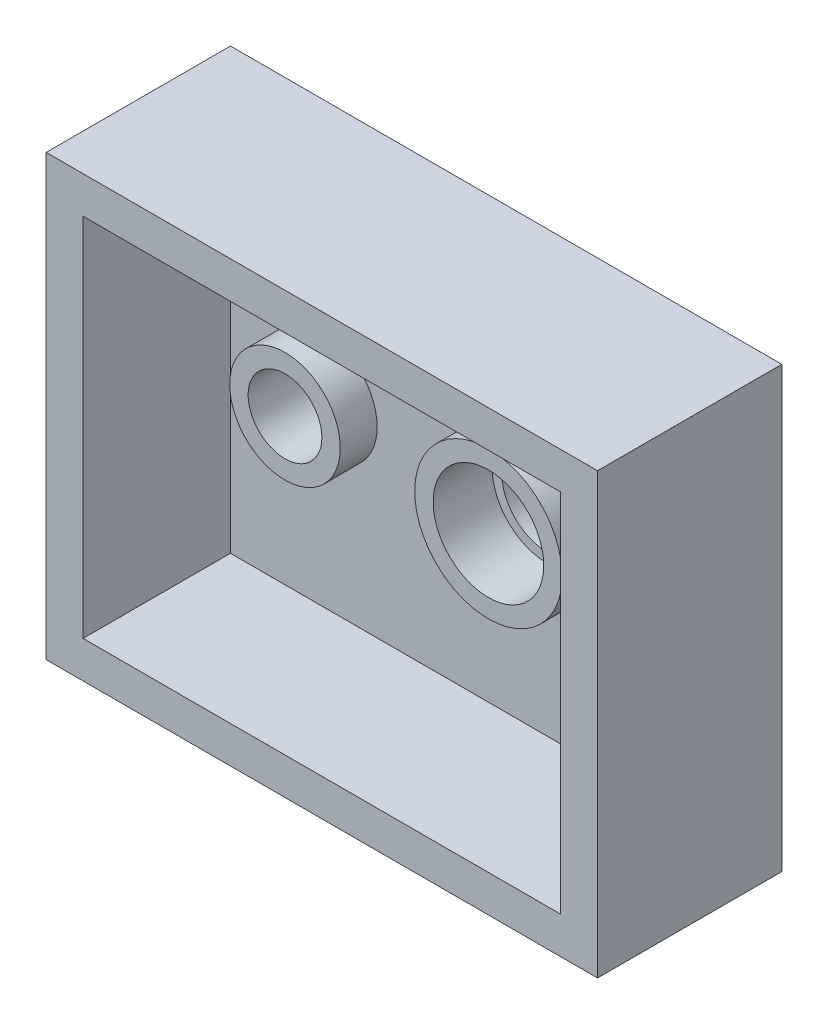
ISO-10303-21;
HEADER;
FILE_DESCRIPTION(('STEP AP214'),'2;1');
FILE_NAME('part.step','',(''),(''),'','','');
FILE_SCHEMA(('AUTOMOTIVE_DESIGN { 1 0 10303 214 1 1 1 1 }'));
ENDSEC;
DATA;
#1=APPLICATION_CONTEXT('core data for automotive mechanical design processes');
#2=APPLICATION_PROTOCOL_DEFINITION('international standard','automotive_design',2000,#1);
#3=PRODUCT_CONTEXT('',#1,'mechanical');
#4=PRODUCT('Part','Part','',(#3));
#5=PRODUCT_RELATED_PRODUCT_CATEGORY('part','',(#4));
#6=PRODUCT_DEFINITION_FORMATION('','',#4);
#7=PRODUCT_DEFINITION_CONTEXT('part definition',#1,'design');
#8=PRODUCT_DEFINITION('design','',#6,#7);
#9=PRODUCT_DEFINITION_SHAPE('','',#8);
#10=(LENGTH_UNIT() NAMED_UNIT(*) SI_UNIT(.MILLI.,.METRE.));
#11=(NAMED_UNIT(*) PLANE_ANGLE_UNIT() SI_UNIT($,.RADIAN.));
#12=(NAMED_UNIT(*) SI_UNIT($,.STERADIAN.) SOLID_ANGLE_UNIT());
#13=UNCERTAINTY_MEASURE_WITH_UNIT(LENGTH_MEASURE(1.E-05),#10,'distance_accuracy_value','');
#14=(GEOMETRIC_REPRESENTATION_CONTEXT(3) GLOBAL_UNCERTAINTY_ASSIGNED_CONTEXT((#13)) GLOBAL_UNIT_ASSIGNED_CONTEXT((#10,
#11,#12)) REPRESENTATION_CONTEXT('',''));
#15=CARTESIAN_POINT('',(0.,0.,0.));
#16=DIRECTION('',(0.,0.,1.));
#17=DIRECTION('',(1.,0.,0.));
#18=AXIS2_PLACEMENT_3D('',#15,#16,#17);
#19=CARTESIAN_POINT('',(-11.049,18.923,3.175));
#20=DIRECTION('',(1.,0.,0.));
#21=DIRECTION('',(0.,1.,0.));
#22=AXIS2_PLACEMENT_3D('',#19,#20,#21);
#23=PLANE('',#22);
#24=DIRECTION('',(0.,-1.,0.));
#25=VECTOR('',#24,1.);
#26=CARTESIAN_POINT('',(-11.049,18.923,0.));
#27=LINE('',#26,#25);
#28=CARTESIAN_POINT('',(-11.049,18.923,0.));
#29=VERTEX_POINT('',#28);
#30=CARTESIAN_POINT('',(-11.049,-18.923,0.));
#31=VERTEX_POINT('',#30);
#32=EDGE_CURVE('E111',#29,#31,#27,.T.);
#33=ORIENTED_EDGE('',*,*,#32,.T.);
#34=DIRECTION('',(0.,0.,-1.));
#35=VECTOR('',#34,1.);
#36=CARTESIAN_POINT('',(-11.049,-18.923,3.175));
#37=LINE('',#36,#35);
#38=CARTESIAN_POINT('',(-11.049,-18.923,15.875));
#39=VERTEX_POINT('',#38);
#40=EDGE_CURVE('E174',#39,#31,#37,.T.);
#41=ORIENTED_EDGE('',*,*,#40,.F.);
#42=DIRECTION('',(0.,-1.,0.));
#43=VECTOR('',#42,1.);
#44=CARTESIAN_POINT('',(-11.049,0.,15.875));
#45=LINE('',#44,#43);
#46=CARTESIAN_POINT('',(-11.049,18.923,15.875));
#47=VERTEX_POINT('',#46);
#48=EDGE_CURVE('E137',#47,#39,#45,.T.);
#49=ORIENTED_EDGE('',*,*,#48,.F.);
#50=DIRECTION('',(0.,0.,-1.));
#51=VECTOR('',#50,1.);
#52=CARTESIAN_POINT('',(-11.049,18.923,3.175));
#53=LINE('',#52,#51);
#54=EDGE_CURVE('E169',#47,#29,#53,.T.);
#55=ORIENTED_EDGE('',*,*,#54,.T.);
#56=EDGE_LOOP('',(#33,#41,#49,#55));
#57=FACE_BOUND('',#56,.T.);
#58=ADVANCED_FACE('F37',(#57),#23,.F.);
#59=CARTESIAN_POINT('',(-11.049,-18.923,3.175));
#60=DIRECTION('',(0.,1.,0.));
#61=DIRECTION('',(0.,0.,1.));
#62=AXIS2_PLACEMENT_3D('',#59,#60,#61);
#63=PLANE('',#62);
#64=DIRECTION('',(1.,0.,0.));
#65=VECTOR('',#64,1.);
#66=CARTESIAN_POINT('',(-11.049,-18.923,0.));
#67=LINE('',#66,#65);
#68=CARTESIAN_POINT('',(36.449,-18.923,0.));
#69=VERTEX_POINT('',#68);
#70=EDGE_CURVE('E162',#31,#69,#67,.T.);
#71=ORIENTED_EDGE('',*,*,#70,.T.);
#72=DIRECTION('',(0.,0.,-1.));
#73=VECTOR('',#72,1.);
#74=CARTESIAN_POINT('',(36.449,-18.923,3.175));
#75=LINE('',#74,#73);
#76=CARTESIAN_POINT('',(36.449,-18.923,15.875));
#77=VERTEX_POINT('',#76);
#78=EDGE_CURVE('E175',#77,#69,#75,.T.);
#79=ORIENTED_EDGE('',*,*,#78,.F.);
#80=DIRECTION('',(1.,0.,0.));
#81=VECTOR('',#80,1.);
#82=CARTESIAN_POINT('',(0.,-18.923,15.875));
#83=LINE('',#82,#81);
#84=EDGE_CURVE('E143',#39,#77,#83,.T.);
#85=ORIENTED_EDGE('',*,*,#84,.F.);
#86=ORIENTED_EDGE('',*,*,#40,.T.);
#87=EDGE_LOOP('',(#71,#79,#85,#86));
#88=FACE_BOUND('',#87,.T.);
#89=ADVANCED_FACE('F231',(#88),#63,.F.);
#90=CARTESIAN_POINT('',(36.449,18.923,3.175));
#91=DIRECTION('',(-1.,0.,0.));
#92=DIRECTION('',(0.,-1.,0.));
#93=AXIS2_PLACEMENT_3D('',#90,#91,#92);
#94=PLANE('',#93);
#95=DIRECTION('',(0.,1.,0.));
#96=VECTOR('',#95,1.);
#97=CARTESIAN_POINT('',(36.449,18.923,0.));
#98=LINE('',#97,#96);
#99=CARTESIAN_POINT('',(36.449,18.923,0.));
#100=VERTEX_POINT('',#99);
#101=EDGE_CURVE('E164',#69,#100,#98,.T.);
#102=ORIENTED_EDGE('',*,*,#101,.T.);
#103=DIRECTION('',(0.,0.,-1.));
#104=VECTOR('',#103,1.);
#105=CARTESIAN_POINT('',(36.449,18.923,3.175));
#106=LINE('',#105,#104);
#107=CARTESIAN_POINT('',(36.449,18.923,15.875));
#108=VERTEX_POINT('',#107);
#109=EDGE_CURVE('E168',#108,#100,#106,.T.);
#110=ORIENTED_EDGE('',*,*,#109,.F.);
#111=DIRECTION('',(0.,1.,0.));
#112=VECTOR('',#111,1.);
#113=CARTESIAN_POINT('',(36.449,0.,15.875));
#114=LINE('',#113,#112);
#115=EDGE_CURVE('E145',#77,#108,#114,.T.);
#116=ORIENTED_EDGE('',*,*,#115,.F.);
#117=ORIENTED_EDGE('',*,*,#78,.T.);
#118=EDGE_LOOP('',(#102,#110,#116,#117));
#119=FACE_BOUND('',#118,.T.);
#120=ADVANCED_FACE('F237',(#119),#94,.F.);
#121=CARTESIAN_POINT('',(-11.049,18.923,3.175));
#122=DIRECTION('',(0.,-1.,0.));
#123=DIRECTION('',(0.,0.,-1.));
#124=AXIS2_PLACEMENT_3D('',#121,#122,#123);
#125=PLANE('',#124);
#126=DIRECTION('',(-1.,0.,0.));
#127=VECTOR('',#126,1.);
#128=CARTESIAN_POINT('',(-11.049,18.923,0.));
#129=LINE('',#128,#127);
#130=EDGE_CURVE('E63',#100,#29,#129,.T.);
#131=ORIENTED_EDGE('',*,*,#130,.T.);
#132=ORIENTED_EDGE('',*,*,#54,.F.);
#133=DIRECTION('',(-1.,0.,0.));
#134=VECTOR('',#133,1.);
#135=CARTESIAN_POINT('',(0.,18.923,15.875));
#136=LINE('',#135,#134);
#137=EDGE_CURVE('E134',#108,#47,#136,.T.);
#138=ORIENTED_EDGE('',*,*,#137,.F.);
#139=ORIENTED_EDGE('',*,*,#109,.T.);
#140=EDGE_LOOP('',(#131,#132,#138,#139));
#141=FACE_BOUND('',#140,.T.);
#142=ADVANCED_FACE('F250',(#141),#125,.F.);
#143=CARTESIAN_POINT('',(0.,0.,0.));
#144=DIRECTION('',(0.,0.,1.));
#145=DIRECTION('',(1.,0.,0.));
#146=AXIS2_PLACEMENT_3D('',#143,#144,#145);
#147=PLANE('',#146);
#148=CARTESIAN_POINT('',(0.,0.,0.));
#149=DIRECTION('',(0.,0.,1.));
#150=DIRECTION('',(1.,0.,0.));
#151=AXIS2_PLACEMENT_3D('',#148,#149,#150);
#152=CIRCLE('',#151,1.524);
#153=CARTESIAN_POINT('',(1.524,0.,0.));
#154=VERTEX_POINT('',#153);
#155=EDGE_CURVE('E182',#154,#154,#152,.T.);
#156=ORIENTED_EDGE('',*,*,#155,.T.);
#157=EDGE_LOOP('',(#156));
#158=FACE_BOUND('',#157,.T.);
#159=CARTESIAN_POINT('',(17.526,0.,0.));
#160=DIRECTION('',(0.,0.,1.));
#161=DIRECTION('',(1.,0.,0.));
#162=AXIS2_PLACEMENT_3D('',#159,#160,#161);
#163=CIRCLE('',#162,3.937);
#164=CARTESIAN_POINT('',(21.463,0.,0.));
#165=VERTEX_POINT('',#164);
#166=EDGE_CURVE('E190',#165,#165,#163,.T.);
#167=ORIENTED_EDGE('',*,*,#166,.T.);
#168=EDGE_LOOP('',(#167));
#169=FACE_BOUND('',#168,.T.);
#170=ORIENTED_EDGE('',*,*,#32,.F.);
#171=ORIENTED_EDGE('',*,*,#130,.F.);
#172=ORIENTED_EDGE('',*,*,#101,.F.);
#173=ORIENTED_EDGE('',*,*,#70,.F.);
#174=EDGE_LOOP('',(#170,#171,#172,#173));
#175=FACE_BOUND('',#174,.T.);
#176=ADVANCED_FACE('F241',(#158,#169,#175),#147,.F.);
#177=CARTESIAN_POINT('',(0.,15.748,15.875));
#178=DIRECTION('',(0.,-1.,0.));
#179=DIRECTION('',(0.,0.,-1.));
#180=AXIS2_PLACEMENT_3D('',#177,#178,#179);
#181=PLANE('',#180);
#182=DIRECTION('',(-1.,0.,0.));
#183=VECTOR('',#182,1.);
#184=CARTESIAN_POINT('',(0.,15.748,3.175));
#185=LINE('',#184,#183);
#186=CARTESIAN_POINT('',(33.274,15.748,3.175));
#187=VERTEX_POINT('',#186);
#188=CARTESIAN_POINT('',(-7.874,15.748,3.175));
#189=VERTEX_POINT('',#188);
#190=EDGE_CURVE('E57',#187,#189,#185,.T.);
#191=ORIENTED_EDGE('',*,*,#190,.F.);
#192=DIRECTION('',(0.,0.,-1.));
#193=VECTOR('',#192,1.);
#194=CARTESIAN_POINT('',(33.274,15.748,15.875));
#195=LINE('',#194,#193);
#196=CARTESIAN_POINT('',(33.274,15.748,15.875));
#197=VERTEX_POINT('',#196);
#198=EDGE_CURVE('E104',#197,#187,#195,.T.);
#199=ORIENTED_EDGE('',*,*,#198,.F.);
#200=DIRECTION('',(-1.,0.,0.));
#201=VECTOR('',#200,1.);
#202=CARTESIAN_POINT('',(0.,15.748,15.875));
#203=LINE('',#202,#201);
#204=CARTESIAN_POINT('',(-7.874,15.748,15.875));
#205=VERTEX_POINT('',#204);
#206=EDGE_CURVE('E107',#197,#205,#203,.T.);
#207=ORIENTED_EDGE('',*,*,#206,.T.);
#208=DIRECTION('',(0.,0.,-1.));
#209=VECTOR('',#208,1.);
#210=CARTESIAN_POINT('',(-7.874,15.748,15.875));
#211=LINE('',#210,#209);
#212=EDGE_CURVE('E150',#205,#189,#211,.T.);
#213=ORIENTED_EDGE('',*,*,#212,.T.);
#214=EDGE_LOOP('',(#191,#199,#207,#213));
#215=FACE_BOUND('',#214,.T.);
#216=ADVANCED_FACE('F110',(#215),#181,.T.);
#217=CARTESIAN_POINT('',(33.274,0.,15.875));
#218=DIRECTION('',(-1.,0.,0.));
#219=DIRECTION('',(0.,-1.,0.));
#220=AXIS2_PLACEMENT_3D('',#217,#218,#219);
#221=PLANE('',#220);
#222=DIRECTION('',(0.,1.,0.));
#223=VECTOR('',#222,1.);
#224=CARTESIAN_POINT('',(33.274,0.,3.175));
#225=LINE('',#224,#223);
#226=CARTESIAN_POINT('',(33.274,-15.748,3.175));
#227=VERTEX_POINT('',#226);
#228=EDGE_CURVE('E149',#227,#187,#225,.T.);
#229=ORIENTED_EDGE('',*,*,#228,.F.);
#230=DIRECTION('',(0.,0.,-1.));
#231=VECTOR('',#230,1.);
#232=CARTESIAN_POINT('',(33.274,-15.748,15.875));
#233=LINE('',#232,#231);
#234=CARTESIAN_POINT('',(33.274,-15.748,15.875));
#235=VERTEX_POINT('',#234);
#236=EDGE_CURVE('E113',#235,#227,#233,.T.);
#237=ORIENTED_EDGE('',*,*,#236,.F.);
#238=DIRECTION('',(0.,1.,0.));
#239=VECTOR('',#238,1.);
#240=CARTESIAN_POINT('',(33.274,0.,15.875));
#241=LINE('',#240,#239);
#242=EDGE_CURVE('E125',#235,#197,#241,.T.);
#243=ORIENTED_EDGE('',*,*,#242,.T.);
#244=ORIENTED_EDGE('',*,*,#198,.T.);
#245=EDGE_LOOP('',(#229,#237,#243,#244));
#246=FACE_BOUND('',#245,.T.);
#247=ADVANCED_FACE('F126',(#246),#221,.T.);
#248=CARTESIAN_POINT('',(0.,-15.748,15.875));
#249=DIRECTION('',(0.,1.,0.));
#250=DIRECTION('',(0.,0.,1.));
#251=AXIS2_PLACEMENT_3D('',#248,#249,#250);
#252=PLANE('',#251);
#253=DIRECTION('',(1.,0.,0.));
#254=VECTOR('',#253,1.);
#255=CARTESIAN_POINT('',(0.,-15.748,3.175));
#256=LINE('',#255,#254);
#257=CARTESIAN_POINT('',(-7.874,-15.748,3.175));
#258=VERTEX_POINT('',#257);
#259=EDGE_CURVE('E155',#258,#227,#256,.T.);
#260=ORIENTED_EDGE('',*,*,#259,.F.);
#261=DIRECTION('',(0.,0.,-1.));
#262=VECTOR('',#261,1.);
#263=CARTESIAN_POINT('',(-7.874,-15.748,15.875));
#264=LINE('',#263,#262);
#265=CARTESIAN_POINT('',(-7.874,-15.748,15.875));
#266=VERTEX_POINT('',#265);
#267=EDGE_CURVE('E158',#266,#258,#264,.T.);
#268=ORIENTED_EDGE('',*,*,#267,.F.);
#269=DIRECTION('',(1.,0.,0.));
#270=VECTOR('',#269,1.);
#271=CARTESIAN_POINT('',(0.,-15.748,15.875));
#272=LINE('',#271,#270);
#273=EDGE_CURVE('E129',#266,#235,#272,.T.);
#274=ORIENTED_EDGE('',*,*,#273,.T.);
#275=ORIENTED_EDGE('',*,*,#236,.T.);
#276=EDGE_LOOP('',(#260,#268,#274,#275));
#277=FACE_BOUND('',#276,.T.);
#278=ADVANCED_FACE('F262',(#277),#252,.T.);
#279=CARTESIAN_POINT('',(-7.874,0.,15.875));
#280=DIRECTION('',(1.,0.,0.));
#281=DIRECTION('',(0.,1.,0.));
#282=AXIS2_PLACEMENT_3D('',#279,#280,#281);
#283=PLANE('',#282);
#284=DIRECTION('',(0.,-1.,0.));
#285=VECTOR('',#284,1.);
#286=CARTESIAN_POINT('',(-7.874,0.,3.175));
#287=LINE('',#286,#285);
#288=EDGE_CURVE('E127',#189,#258,#287,.T.);
#289=ORIENTED_EDGE('',*,*,#288,.F.);
#290=ORIENTED_EDGE('',*,*,#212,.F.);
#291=DIRECTION('',(0.,-1.,0.));
#292=VECTOR('',#291,1.);
#293=CARTESIAN_POINT('',(-7.874,0.,15.875));
#294=LINE('',#293,#292);
#295=EDGE_CURVE('E124',#205,#266,#294,.T.);
#296=ORIENTED_EDGE('',*,*,#295,.T.);
#297=ORIENTED_EDGE('',*,*,#267,.T.);
#298=EDGE_LOOP('',(#289,#290,#296,#297));
#299=FACE_BOUND('',#298,.T.);
#300=ADVANCED_FACE('F270',(#299),#283,.T.);
#301=CARTESIAN_POINT('',(0.,0.,15.875));
#302=DIRECTION('',(0.,0.,1.));
#303=DIRECTION('',(1.,0.,0.));
#304=AXIS2_PLACEMENT_3D('',#301,#302,#303);
#305=PLANE('',#304);
#306=ORIENTED_EDGE('',*,*,#206,.F.);
#307=ORIENTED_EDGE('',*,*,#242,.F.);
#308=ORIENTED_EDGE('',*,*,#273,.F.);
#309=ORIENTED_EDGE('',*,*,#295,.F.);
#310=EDGE_LOOP('',(#306,#307,#308,#309));
#311=FACE_BOUND('',#310,.T.);
#312=ORIENTED_EDGE('',*,*,#137,.T.);
#313=ORIENTED_EDGE('',*,*,#48,.T.);
#314=ORIENTED_EDGE('',*,*,#84,.T.);
#315=ORIENTED_EDGE('',*,*,#115,.T.);
#316=EDGE_LOOP('',(#312,#313,#314,#315));
#317=FACE_BOUND('',#316,.T.);
#318=ADVANCED_FACE('F118',(#311,#317),#305,.T.);
#319=CARTESIAN_POINT('',(0.,0.,3.175));
#320=DIRECTION('',(0.,0.,1.));
#321=DIRECTION('',(1.,0.,0.));
#322=AXIS2_PLACEMENT_3D('',#319,#320,#321);
#323=PLANE('',#322);
#324=CARTESIAN_POINT('',(17.526,0.,3.175));
#325=DIRECTION('',(0.,0.,1.));
#326=DIRECTION('',(1.,0.,0.));
#327=AXIS2_PLACEMENT_3D('',#324,#325,#326);
#328=CIRCLE('',#327,6.35);
#329=CARTESIAN_POINT('',(23.876,0.,3.175));
#330=VERTEX_POINT('',#329);
#331=EDGE_CURVE('E11',#330,#330,#328,.T.);
#332=ORIENTED_EDGE('',*,*,#331,.F.);
#333=EDGE_LOOP('',(#332));
#334=FACE_BOUND('',#333,.T.);
#335=CARTESIAN_POINT('',(0.,0.,3.175));
#336=DIRECTION('',(0.,0.,1.));
#337=DIRECTION('',(1.,0.,0.));
#338=AXIS2_PLACEMENT_3D('',#335,#336,#337);
#339=CIRCLE('',#338,4.7625);
#340=CARTESIAN_POINT('',(4.7625,0.,3.175));
#341=VERTEX_POINT('',#340);
#342=EDGE_CURVE('E48',#341,#341,#339,.T.);
#343=ORIENTED_EDGE('',*,*,#342,.F.);
#344=EDGE_LOOP('',(#343));
#345=FACE_BOUND('',#344,.T.);
#346=ORIENTED_EDGE('',*,*,#228,.T.);
#347=ORIENTED_EDGE('',*,*,#190,.T.);
#348=ORIENTED_EDGE('',*,*,#288,.T.);
#349=ORIENTED_EDGE('',*,*,#259,.T.);
#350=EDGE_LOOP('',(#346,#347,#348,#349));
#351=FACE_BOUND('',#350,.T.);
#352=ADVANCED_FACE('F223',(#334,#345,#351),#323,.T.);
#353=CARTESIAN_POINT('',(0.,0.,6.35));
#354=DIRECTION('',(0.,0.,-1.));
#355=DIRECTION('',(-1.,0.,0.));
#356=AXIS2_PLACEMENT_3D('',#353,#354,#355);
#357=CYLINDRICAL_SURFACE('',#356,4.7625);
#358=ORIENTED_EDGE('',*,*,#342,.T.);
#359=EDGE_LOOP('',(#358));
#360=FACE_BOUND('',#359,.T.);
#361=CARTESIAN_POINT('',(0.,0.,6.35));
#362=DIRECTION('',(0.,0.,-1.));
#363=DIRECTION('',(-1.,0.,0.));
#364=AXIS2_PLACEMENT_3D('',#361,#362,#363);
#365=CIRCLE('',#364,4.7625);
#366=CARTESIAN_POINT('',(-4.7625,0.,6.35));
#367=VERTEX_POINT('',#366);
#368=EDGE_CURVE('E197',#367,#367,#365,.T.);
#369=ORIENTED_EDGE('',*,*,#368,.T.);
#370=EDGE_LOOP('',(#369));
#371=FACE_BOUND('',#370,.T.);
#372=ADVANCED_FACE('F209',(#360,#371),#357,.T.);
#373=CARTESIAN_POINT('',(0.,0.,6.35));
#374=DIRECTION('',(0.,0.,-1.));
#375=DIRECTION('',(-1.,0.,0.));
#376=AXIS2_PLACEMENT_3D('',#373,#374,#375);
#377=PLANE('',#376);
#378=CARTESIAN_POINT('',(0.,0.,6.35));
#379=DIRECTION('',(0.,0.,1.));
#380=DIRECTION('',(1.,0.,0.));
#381=AXIS2_PLACEMENT_3D('',#378,#379,#380);
#382=CIRCLE('',#381,3.175);
#383=CARTESIAN_POINT('',(3.175,0.,6.35));
#384=VERTEX_POINT('',#383);
#385=EDGE_CURVE('E203',#384,#384,#382,.T.);
#386=ORIENTED_EDGE('',*,*,#385,.F.);
#387=EDGE_LOOP('',(#386));
#388=FACE_BOUND('',#387,.T.);
#389=ORIENTED_EDGE('',*,*,#368,.F.);
#390=EDGE_LOOP('',(#389));
#391=FACE_BOUND('',#390,.T.);
#392=ADVANCED_FACE('F215',(#388,#391),#377,.F.);
#393=CARTESIAN_POINT('',(17.526,0.,6.35));
#394=DIRECTION('',(0.,0.,-1.));
#395=DIRECTION('',(-1.,0.,0.));
#396=AXIS2_PLACEMENT_3D('',#393,#394,#395);
#397=CYLINDRICAL_SURFACE('',#396,6.35);
#398=ORIENTED_EDGE('',*,*,#331,.T.);
#399=EDGE_LOOP('',(#398));
#400=FACE_BOUND('',#399,.T.);
#401=CARTESIAN_POINT('',(17.526,0.,6.35));
#402=DIRECTION('',(0.,0.,-1.));
#403=DIRECTION('',(-1.,0.,0.));
#404=AXIS2_PLACEMENT_3D('',#401,#402,#403);
#405=CIRCLE('',#404,6.35);
#406=CARTESIAN_POINT('',(11.176,0.,6.35));
#407=VERTEX_POINT('',#406);
#408=EDGE_CURVE('E147',#407,#407,#405,.T.);
#409=ORIENTED_EDGE('',*,*,#408,.T.);
#410=EDGE_LOOP('',(#409));
#411=FACE_BOUND('',#410,.T.);
#412=ADVANCED_FACE('F212',(#400,#411),#397,.T.);
#413=CARTESIAN_POINT('',(17.526,0.,6.35));
#414=DIRECTION('',(0.,0.,-1.));
#415=DIRECTION('',(-1.,0.,0.));
#416=AXIS2_PLACEMENT_3D('',#413,#414,#415);
#417=PLANE('',#416);
#418=CARTESIAN_POINT('',(17.526,0.,6.35));
#419=DIRECTION('',(0.,0.,1.));
#420=DIRECTION('',(1.,0.,0.));
#421=AXIS2_PLACEMENT_3D('',#418,#419,#420);
#422=CIRCLE('',#421,4.7625);
#423=CARTESIAN_POINT('',(22.2885,0.,6.35));
#424=VERTEX_POINT('',#423);
#425=EDGE_CURVE('E196',#424,#424,#422,.T.);
#426=ORIENTED_EDGE('',*,*,#425,.F.);
#427=EDGE_LOOP('',(#426));
#428=FACE_BOUND('',#427,.T.);
#429=ORIENTED_EDGE('',*,*,#408,.F.);
#430=EDGE_LOOP('',(#429));
#431=FACE_BOUND('',#430,.T.);
#432=ADVANCED_FACE('F222',(#428,#431),#417,.F.);
#433=CARTESIAN_POINT('',(17.526,0.,1.27));
#434=DIRECTION('',(0.,0.,1.));
#435=DIRECTION('',(1.,0.,0.));
#436=AXIS2_PLACEMENT_3D('',#433,#434,#435);
#437=CYLINDRICAL_SURFACE('',#436,4.7625);
#438=CARTESIAN_POINT('',(17.526,0.,1.27));
#439=DIRECTION('',(0.,0.,1.));
#440=DIRECTION('',(1.,0.,0.));
#441=AXIS2_PLACEMENT_3D('',#438,#439,#440);
#442=CIRCLE('',#441,4.7625);
#443=CARTESIAN_POINT('',(22.2885,0.,1.27));
#444=VERTEX_POINT('',#443);
#445=EDGE_CURVE('E193',#444,#444,#442,.T.);
#446=ORIENTED_EDGE('',*,*,#445,.F.);
#447=EDGE_LOOP('',(#446));
#448=FACE_BOUND('',#447,.T.);
#449=ORIENTED_EDGE('',*,*,#425,.T.);
#450=EDGE_LOOP('',(#449));
#451=FACE_BOUND('',#450,.T.);
#452=ADVANCED_FACE('F303',(#448,#451),#437,.F.);
#453=CARTESIAN_POINT('',(17.526,0.,1.27));
#454=DIRECTION('',(0.,0.,1.));
#455=DIRECTION('',(1.,0.,0.));
#456=AXIS2_PLACEMENT_3D('',#453,#454,#455);
#457=PLANE('',#456);
#458=CARTESIAN_POINT('',(17.526,0.,1.27));
#459=DIRECTION('',(0.,0.,1.));
#460=DIRECTION('',(1.,0.,0.));
#461=AXIS2_PLACEMENT_3D('',#458,#459,#460);
#462=CIRCLE('',#461,3.937);
#463=CARTESIAN_POINT('',(21.463,0.,1.27));
#464=VERTEX_POINT('',#463);
#465=EDGE_CURVE('E43',#464,#464,#462,.T.);
#466=ORIENTED_EDGE('',*,*,#465,.F.);
#467=EDGE_LOOP('',(#466));
#468=FACE_BOUND('',#467,.T.);
#469=ORIENTED_EDGE('',*,*,#445,.T.);
#470=EDGE_LOOP('',(#469));
#471=FACE_BOUND('',#470,.T.);
#472=ADVANCED_FACE('F314',(#468,#471),#457,.T.);
#473=CARTESIAN_POINT('',(0.,0.,1.27));
#474=DIRECTION('',(0.,0.,1.));
#475=DIRECTION('',(1.,0.,0.));
#476=AXIS2_PLACEMENT_3D('',#473,#474,#475);
#477=CYLINDRICAL_SURFACE('',#476,3.175);
#478=CARTESIAN_POINT('',(0.,0.,1.27));
#479=DIRECTION('',(0.,0.,1.));
#480=DIRECTION('',(1.,0.,0.));
#481=AXIS2_PLACEMENT_3D('',#478,#479,#480);
#482=CIRCLE('',#481,3.175);
#483=CARTESIAN_POINT('',(3.175,0.,1.27));
#484=VERTEX_POINT('',#483);
#485=EDGE_CURVE('E183',#484,#484,#482,.T.);
#486=ORIENTED_EDGE('',*,*,#485,.F.);
#487=EDGE_LOOP('',(#486));
#488=FACE_BOUND('',#487,.T.);
#489=ORIENTED_EDGE('',*,*,#385,.T.);
#490=EDGE_LOOP('',(#489));
#491=FACE_BOUND('',#490,.T.);
#492=ADVANCED_FACE('F324',(#488,#491),#477,.F.);
#493=CARTESIAN_POINT('',(0.,0.,1.27));
#494=DIRECTION('',(0.,0.,1.));
#495=DIRECTION('',(1.,0.,0.));
#496=AXIS2_PLACEMENT_3D('',#493,#494,#495);
#497=PLANE('',#496);
#498=CARTESIAN_POINT('',(0.,0.,1.27));
#499=DIRECTION('',(0.,0.,1.));
#500=DIRECTION('',(1.,0.,0.));
#501=AXIS2_PLACEMENT_3D('',#498,#499,#500);
#502=CIRCLE('',#501,1.524);
#503=CARTESIAN_POINT('',(1.524,0.,1.27));
#504=VERTEX_POINT('',#503);
#505=EDGE_CURVE('E178',#504,#504,#502,.T.);
#506=ORIENTED_EDGE('',*,*,#505,.F.);
#507=EDGE_LOOP('',(#506));
#508=FACE_BOUND('',#507,.T.);
#509=ORIENTED_EDGE('',*,*,#485,.T.);
#510=EDGE_LOOP('',(#509));
#511=FACE_BOUND('',#510,.T.);
#512=ADVANCED_FACE('F333',(#508,#511),#497,.T.);
#513=CARTESIAN_POINT('',(0.,0.,0.));
#514=DIRECTION('',(0.,0.,1.));
#515=DIRECTION('',(1.,0.,0.));
#516=AXIS2_PLACEMENT_3D('',#513,#514,#515);
#517=CYLINDRICAL_SURFACE('',#516,1.524);
#518=ORIENTED_EDGE('',*,*,#505,.T.);
#519=EDGE_LOOP('',(#518));
#520=FACE_BOUND('',#519,.T.);
#521=ORIENTED_EDGE('',*,*,#155,.F.);
#522=EDGE_LOOP('',(#521));
#523=FACE_BOUND('',#522,.T.);
#524=ADVANCED_FACE('F343',(#520,#523),#517,.F.);
#525=CARTESIAN_POINT('',(17.526,0.,0.));
#526=DIRECTION('',(0.,0.,1.));
#527=DIRECTION('',(1.,0.,0.));
#528=AXIS2_PLACEMENT_3D('',#525,#526,#527);
#529=CYLINDRICAL_SURFACE('',#528,3.937);
#530=ORIENTED_EDGE('',*,*,#465,.T.);
#531=EDGE_LOOP('',(#530));
#532=FACE_BOUND('',#531,.T.);
#533=ORIENTED_EDGE('',*,*,#166,.F.);
#534=EDGE_LOOP('',(#533));
#535=FACE_BOUND('',#534,.T.);
#536=ADVANCED_FACE('F353',(#532,#535),#529,.F.);
#537=CLOSED_SHELL('',(#58,#89,#120,#142,#176,#216,#247,#278,#300,#318,#352,#372,#392,#412,#432,
#452,#472,#492,#512,#524,#536));
#538=MANIFOLD_SOLID_BREP('B2',#537);
#539=ADVANCED_BREP_SHAPE_REPRESENTATION('',(#18,#538),#14);
#540=SHAPE_DEFINITION_REPRESENTATION(#9,#539);
ENDSEC;
END-ISO-10303-21;
